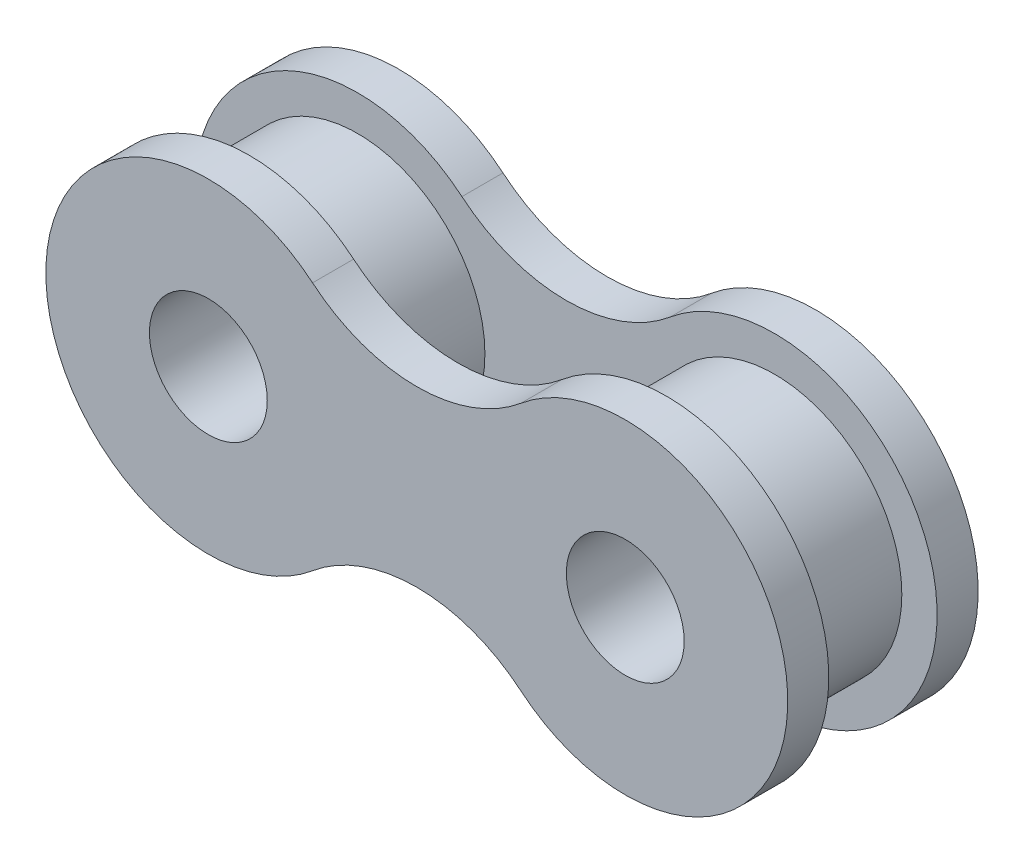
ISO-10303-21;
HEADER;
FILE_DESCRIPTION(('STEP AP214'),'2;1');
FILE_NAME('part.step','',(''),(''),'','','');
FILE_SCHEMA(('AUTOMOTIVE_DESIGN { 1 0 10303 214 1 1 1 1 }'));
ENDSEC;
DATA;
#1=APPLICATION_CONTEXT('core data for automotive mechanical design processes');
#2=APPLICATION_PROTOCOL_DEFINITION('international standard','automotive_design',2000,#1);
#3=PRODUCT_CONTEXT('',#1,'mechanical');
#4=PRODUCT('Part','Part','',(#3));
#5=PRODUCT_RELATED_PRODUCT_CATEGORY('part','',(#4));
#6=PRODUCT_DEFINITION_FORMATION('','',#4);
#7=PRODUCT_DEFINITION_CONTEXT('part definition',#1,'design');
#8=PRODUCT_DEFINITION('design','',#6,#7);
#9=PRODUCT_DEFINITION_SHAPE('','',#8);
#10=(LENGTH_UNIT() NAMED_UNIT(*) SI_UNIT(.MILLI.,.METRE.));
#11=(NAMED_UNIT(*) PLANE_ANGLE_UNIT() SI_UNIT($,.RADIAN.));
#12=(NAMED_UNIT(*) SI_UNIT($,.STERADIAN.) SOLID_ANGLE_UNIT());
#13=UNCERTAINTY_MEASURE_WITH_UNIT(LENGTH_MEASURE(1.E-05),#10,'distance_accuracy_value','');
#14=(GEOMETRIC_REPRESENTATION_CONTEXT(3) GLOBAL_UNCERTAINTY_ASSIGNED_CONTEXT((#13)) GLOBAL_UNIT_ASSIGNED_CONTEXT((#10,
#11,#12)) REPRESENTATION_CONTEXT('',''));
#15=CARTESIAN_POINT('',(0.,0.,0.));
#16=DIRECTION('',(0.,0.,1.));
#17=DIRECTION('',(1.,0.,0.));
#18=AXIS2_PLACEMENT_3D('',#15,#16,#17);
#19=CARTESIAN_POINT('',(9.99200722162641E-13,-12.5440007893938,1.65));
#20=DIRECTION('',(0.,0.,0.999999999999992));
#21=DIRECTION('',(1.00000000000001,0.,0.));
#22=AXIS2_PLACEMENT_3D('',#19,#20,#21);
#23=CYLINDRICAL_SURFACE('',#22,4.95);
#24=CARTESIAN_POINT('',(6.66133814775094E-13,-12.5440007893934,2.8999999999999));
#25=DIRECTION('',(0.,0.,0.999999999999992));
#26=DIRECTION('',(1.00000000000001,0.,0.));
#27=AXIS2_PLACEMENT_3D('',#24,#25,#26);
#28=CIRCLE('',#27,4.95);
#29=CARTESIAN_POINT('',(3.17500000000032,-8.7463864066524,2.90000000000001));
#30=VERTEX_POINT('',#29);
#31=CARTESIAN_POINT('',(-3.17499999999982,-8.74638640665251,2.90000000000004));
#32=VERTEX_POINT('',#31);
#33=EDGE_CURVE('E160',#30,#32,#28,.T.);
#34=ORIENTED_EDGE('',*,*,#33,.T.);
#35=DIRECTION('',(0.,0.,0.999999999999992));
#36=VECTOR('',#35,1.);
#37=CARTESIAN_POINT('',(-3.17499999999971,-8.74638640665221,1.65000000000004));
#38=LINE('',#37,#36);
#39=CARTESIAN_POINT('',(-3.17499999999971,-8.74638640665221,1.65000000000004));
#40=VERTEX_POINT('',#39);
#41=EDGE_CURVE('E12',#40,#32,#38,.T.);
#42=ORIENTED_EDGE('',*,*,#41,.F.);
#43=CARTESIAN_POINT('',(9.99200722162641E-13,-12.5440007893938,1.65));
#44=DIRECTION('',(0.,0.,0.999999999999992));
#45=DIRECTION('',(1.00000000000001,0.,0.));
#46=AXIS2_PLACEMENT_3D('',#43,#44,#45);
#47=CIRCLE('',#46,4.95);
#48=CARTESIAN_POINT('',(3.17500000000059,-8.74638640665265,1.65000000000001));
#49=VERTEX_POINT('',#48);
#50=EDGE_CURVE('E66',#49,#40,#47,.T.);
#51=ORIENTED_EDGE('',*,*,#50,.F.);
#52=DIRECTION('',(0.,0.,0.999999999999992));
#53=VECTOR('',#52,1.);
#54=CARTESIAN_POINT('',(3.17500000000059,-8.74638640665265,1.65000000000001));
#55=LINE('',#54,#53);
#56=EDGE_CURVE('E51',#49,#30,#55,.T.);
#57=ORIENTED_EDGE('',*,*,#56,.T.);
#58=EDGE_LOOP('',(#34,#42,#51,#57));
#59=FACE_BOUND('',#58,.T.);
#60=ADVANCED_FACE('F48',(#59),#23,.F.);
#61=CARTESIAN_POINT('',(-6.34999999999947,-4.94877202391159,1.65000000000001));
#62=DIRECTION('',(0.,0.,0.999999999999992));
#63=DIRECTION('',(1.00000000000001,0.,0.));
#64=AXIS2_PLACEMENT_3D('',#61,#62,#63);
#65=CYLINDRICAL_SURFACE('',#64,4.95);
#66=CARTESIAN_POINT('',(-6.34999999999974,-4.94877202391172,2.90000000000001));
#67=DIRECTION('',(0.,0.,0.999999999999992));
#68=DIRECTION('',(1.00000000000001,0.,0.));
#69=AXIS2_PLACEMENT_3D('',#66,#67,#68);
#70=CIRCLE('',#69,4.95);
#71=CARTESIAN_POINT('',(-3.17499999999965,-1.15115764117063,2.89999999999988));
#72=VERTEX_POINT('',#71);
#73=EDGE_CURVE('E175',#72,#32,#70,.T.);
#74=ORIENTED_EDGE('',*,*,#73,.F.);
#75=DIRECTION('',(0.,0.,0.999999999999992));
#76=VECTOR('',#75,1.);
#77=CARTESIAN_POINT('',(-3.17499999999921,-1.15115764117069,1.6499999999999));
#78=LINE('',#77,#76);
#79=CARTESIAN_POINT('',(-3.17499999999921,-1.15115764117069,1.6499999999999));
#80=VERTEX_POINT('',#79);
#81=EDGE_CURVE('E57',#80,#72,#78,.T.);
#82=ORIENTED_EDGE('',*,*,#81,.F.);
#83=CARTESIAN_POINT('',(-6.34999999999947,-4.94877202391159,1.65000000000001));
#84=DIRECTION('',(0.,0.,0.999999999999992));
#85=DIRECTION('',(1.00000000000001,0.,0.));
#86=AXIS2_PLACEMENT_3D('',#83,#84,#85);
#87=CIRCLE('',#86,4.95);
#88=EDGE_CURVE('E167',#80,#40,#87,.T.);
#89=ORIENTED_EDGE('',*,*,#88,.T.);
#90=ORIENTED_EDGE('',*,*,#41,.T.);
#91=EDGE_LOOP('',(#74,#82,#89,#90));
#92=FACE_BOUND('',#91,.T.);
#93=ADVANCED_FACE('F206',(#92),#65,.T.);
#94=CARTESIAN_POINT('',(4.44089209850063E-13,2.64645674157049,1.65000000000003));
#95=DIRECTION('',(0.,0.,0.999999999999992));
#96=DIRECTION('',(1.00000000000001,0.,0.));
#97=AXIS2_PLACEMENT_3D('',#94,#95,#96);
#98=CYLINDRICAL_SURFACE('',#97,4.95);
#99=CARTESIAN_POINT('',(1.66533453693773E-13,2.64645674156985,2.90000000000003));
#100=DIRECTION('',(0.,0.,0.999999999999992));
#101=DIRECTION('',(1.00000000000001,0.,0.));
#102=AXIS2_PLACEMENT_3D('',#99,#100,#101);
#103=CIRCLE('',#102,4.95);
#104=CARTESIAN_POINT('',(3.17500000000048,-1.15115764117069,2.89999999999996));
#105=VERTEX_POINT('',#104);
#106=EDGE_CURVE('E173',#72,#105,#103,.T.);
#107=ORIENTED_EDGE('',*,*,#106,.T.);
#108=DIRECTION('',(0.,0.,0.999999999999992));
#109=VECTOR('',#108,1.);
#110=CARTESIAN_POINT('',(3.17500000000065,-1.15115764117046,1.64999999999997));
#111=LINE('',#110,#109);
#112=CARTESIAN_POINT('',(3.17500000000065,-1.15115764117046,1.64999999999997));
#113=VERTEX_POINT('',#112);
#114=EDGE_CURVE('E183',#113,#105,#111,.T.);
#115=ORIENTED_EDGE('',*,*,#114,.F.);
#116=CARTESIAN_POINT('',(4.44089209850063E-13,2.64645674157049,1.65000000000003));
#117=DIRECTION('',(0.,0.,0.999999999999992));
#118=DIRECTION('',(1.00000000000001,0.,0.));
#119=AXIS2_PLACEMENT_3D('',#116,#117,#118);
#120=CIRCLE('',#119,4.95);
#121=EDGE_CURVE('E165',#80,#113,#120,.T.);
#122=ORIENTED_EDGE('',*,*,#121,.F.);
#123=ORIENTED_EDGE('',*,*,#81,.T.);
#124=EDGE_LOOP('',(#107,#115,#122,#123));
#125=FACE_BOUND('',#124,.T.);
#126=ADVANCED_FACE('F201',(#125),#98,.F.);
#127=CARTESIAN_POINT('',(6.35000000000063,-4.9487720239115,1.65));
#128=DIRECTION('',(0.,0.,0.999999999999992));
#129=DIRECTION('',(1.00000000000001,0.,0.));
#130=AXIS2_PLACEMENT_3D('',#127,#128,#129);
#131=CYLINDRICAL_SURFACE('',#130,1.795);
#132=CARTESIAN_POINT('',(6.35000000000035,-4.9487720239117,2.9));
#133=DIRECTION('',(0.,0.,0.999999999999992));
#134=DIRECTION('',(1.00000000000001,0.,0.));
#135=AXIS2_PLACEMENT_3D('',#132,#133,#134);
#136=CIRCLE('',#135,1.795);
#137=CARTESIAN_POINT('',(8.14500000000065,-4.9487720239115,2.9));
#138=VERTEX_POINT('',#137);
#139=EDGE_CURVE('E178',#138,#138,#136,.T.);
#140=CARTESIAN_POINT('',(6.35000000000085,-4.94877202391164,-2.9));
#141=DIRECTION('',(0.,0.,0.999999999999992));
#142=DIRECTION('',(1.00000000000001,0.,0.));
#143=AXIS2_PLACEMENT_3D('',#140,#141,#142);
#144=CIRCLE('',#143,1.795);
#145=CARTESIAN_POINT('',(8.14500000000065,-4.9487720239115,-2.9));
#146=VERTEX_POINT('',#145);
#147=EDGE_CURVE('E267',#146,#146,#144,.T.);
#148=CARTESIAN_POINT('',(8.14500000000065,-4.9487720239115,2.9));
#149=CARTESIAN_POINT('',(8.14500000000065,-4.9487720239115,2.83958333333333));
#150=CARTESIAN_POINT('',(8.14500000000065,-4.9487720239115,2.77916666666667));
#151=CARTESIAN_POINT('',(8.14500000000065,-4.9487720239115,2.65833333333333));
#152=CARTESIAN_POINT('',(8.14500000000065,-4.9487720239115,2.59791666666667));
#153=CARTESIAN_POINT('',(8.14500000000065,-4.9487720239115,2.47708333333333));
#154=CARTESIAN_POINT('',(8.14500000000065,-4.9487720239115,2.41666666666667));
#155=CARTESIAN_POINT('',(8.14500000000065,-4.9487720239115,2.29583333333333));
#156=CARTESIAN_POINT('',(8.14500000000065,-4.9487720239115,2.23541666666667));
#157=CARTESIAN_POINT('',(8.14500000000065,-4.9487720239115,2.11458333333333));
#158=CARTESIAN_POINT('',(8.14500000000065,-4.9487720239115,2.05416666666667));
#159=CARTESIAN_POINT('',(8.14500000000065,-4.9487720239115,1.93333333333333));
#160=CARTESIAN_POINT('',(8.14500000000065,-4.9487720239115,1.87291666666667));
#161=CARTESIAN_POINT('',(8.14500000000065,-4.9487720239115,1.75208333333333));
#162=CARTESIAN_POINT('',(8.14500000000065,-4.9487720239115,1.69166666666667));
#163=CARTESIAN_POINT('',(8.14500000000065,-4.9487720239115,1.57083333333333));
#164=CARTESIAN_POINT('',(8.14500000000065,-4.9487720239115,1.51041666666667));
#165=CARTESIAN_POINT('',(8.14500000000065,-4.9487720239115,1.38958333333333));
#166=CARTESIAN_POINT('',(8.14500000000065,-4.9487720239115,1.32916666666667));
#167=CARTESIAN_POINT('',(8.14500000000065,-4.9487720239115,1.20833333333333));
#168=CARTESIAN_POINT('',(8.14500000000065,-4.9487720239115,1.14791666666667));
#169=CARTESIAN_POINT('',(8.14500000000065,-4.9487720239115,1.02708333333333));
#170=CARTESIAN_POINT('',(8.14500000000065,-4.9487720239115,0.966666666666667));
#171=CARTESIAN_POINT('',(8.14500000000065,-4.9487720239115,0.845833333333334));
#172=CARTESIAN_POINT('',(8.14500000000065,-4.9487720239115,0.785416666666667));
#173=CARTESIAN_POINT('',(8.14500000000065,-4.9487720239115,0.664583333333334));
#174=CARTESIAN_POINT('',(8.14500000000065,-4.9487720239115,0.604166666666667));
#175=CARTESIAN_POINT('',(8.14500000000065,-4.9487720239115,0.483333333333334));
#176=CARTESIAN_POINT('',(8.14500000000065,-4.9487720239115,0.422916666666667));
#177=CARTESIAN_POINT('',(8.14500000000065,-4.9487720239115,0.302083333333333));
#178=CARTESIAN_POINT('',(8.14500000000065,-4.9487720239115,0.241666666666667));
#179=CARTESIAN_POINT('',(8.14500000000065,-4.9487720239115,0.120833333333333));
#180=CARTESIAN_POINT('',(8.14500000000065,-4.9487720239115,0.0604166666666668));
#181=CARTESIAN_POINT('',(8.14500000000065,-4.9487720239115,-0.0604166666666664));
#182=CARTESIAN_POINT('',(8.14500000000065,-4.9487720239115,-0.120833333333333));
#183=CARTESIAN_POINT('',(8.14500000000065,-4.9487720239115,-0.241666666666666));
#184=CARTESIAN_POINT('',(8.14500000000065,-4.9487720239115,-0.302083333333333));
#185=CARTESIAN_POINT('',(8.14500000000065,-4.9487720239115,-0.422916666666667));
#186=CARTESIAN_POINT('',(8.14500000000065,-4.9487720239115,-0.483333333333333));
#187=CARTESIAN_POINT('',(8.14500000000065,-4.9487720239115,-0.604166666666667));
#188=CARTESIAN_POINT('',(8.14500000000065,-4.9487720239115,-0.664583333333333));
#189=CARTESIAN_POINT('',(8.14500000000065,-4.9487720239115,-0.785416666666667));
#190=CARTESIAN_POINT('',(8.14500000000065,-4.9487720239115,-0.845833333333333));
#191=CARTESIAN_POINT('',(8.14500000000065,-4.9487720239115,-0.966666666666667));
#192=CARTESIAN_POINT('',(8.14500000000065,-4.9487720239115,-1.02708333333333));
#193=CARTESIAN_POINT('',(8.14500000000065,-4.9487720239115,-1.14791666666667));
#194=CARTESIAN_POINT('',(8.14500000000065,-4.9487720239115,-1.20833333333333));
#195=CARTESIAN_POINT('',(8.14500000000065,-4.9487720239115,-1.32916666666667));
#196=CARTESIAN_POINT('',(8.14500000000065,-4.9487720239115,-1.38958333333333));
#197=CARTESIAN_POINT('',(8.14500000000065,-4.9487720239115,-1.51041666666667));
#198=CARTESIAN_POINT('',(8.14500000000065,-4.9487720239115,-1.57083333333333));
#199=CARTESIAN_POINT('',(8.14500000000065,-4.9487720239115,-1.69166666666667));
#200=CARTESIAN_POINT('',(8.14500000000065,-4.9487720239115,-1.75208333333333));
#201=CARTESIAN_POINT('',(8.14500000000065,-4.9487720239115,-1.87291666666667));
#202=CARTESIAN_POINT('',(8.14500000000065,-4.9487720239115,-1.93333333333333));
#203=CARTESIAN_POINT('',(8.14500000000065,-4.9487720239115,-2.05416666666667));
#204=CARTESIAN_POINT('',(8.14500000000065,-4.9487720239115,-2.11458333333333));
#205=CARTESIAN_POINT('',(8.14500000000065,-4.9487720239115,-2.23541666666667));
#206=CARTESIAN_POINT('',(8.14500000000065,-4.9487720239115,-2.29583333333333));
#207=CARTESIAN_POINT('',(8.14500000000065,-4.9487720239115,-2.41666666666667));
#208=CARTESIAN_POINT('',(8.14500000000065,-4.9487720239115,-2.47708333333333));
#209=CARTESIAN_POINT('',(8.14500000000065,-4.9487720239115,-2.59791666666667));
#210=CARTESIAN_POINT('',(8.14500000000065,-4.9487720239115,-2.65833333333333));
#211=CARTESIAN_POINT('',(8.14500000000065,-4.9487720239115,-2.77916666666667));
#212=CARTESIAN_POINT('',(8.14500000000065,-4.9487720239115,-2.83958333333333));
#213=CARTESIAN_POINT('',(8.14500000000065,-4.9487720239115,-2.9));
#214=B_SPLINE_CURVE_WITH_KNOTS('',3,(#148,#149,#150,#151,#152,#153,#154,#155,#156,#157,#158,
#159,#160,#161,#162,#163,#164,#165,#166,#167,#168,#169,#170,#171,#172,#173,#174,#175,#176,#177,
#178,#179,#180,#181,#182,#183,#184,#185,#186,#187,#188,#189,#190,#191,#192,#193,#194,#195,#196,
#197,#198,#199,#200,#201,#202,#203,#204,#205,#206,#207,#208,#209,#210,#211,#212,#213),
.UNSPECIFIED.,.F.,.F.,(4,2,2,2,2,2,2,2,2,2,2,2,2,2,2,2,2,2,2,2,2,2,2,2,2,2,2,2,2,2,2,2,4),(0.,
0.18125,0.3625,0.54375,0.725,0.90625,1.0875,1.26875,1.45,1.63125,1.8125,1.99375,2.175,2.35625,
2.5375,2.71875,2.9,3.08125,3.2625,3.44375,3.625,3.80625,3.9875,4.16875,4.35,4.53125,4.7125,
4.89375,5.075,5.25625,5.4375,5.61875,5.8),.UNSPECIFIED.);
#215=EDGE_CURVE('BSEAM193',#138,#146,#214,.T.);
#216=ORIENTED_EDGE('',*,*,#139,.T.);
#217=ORIENTED_EDGE('',*,*,#147,.F.);
#218=ORIENTED_EDGE('',*,*,#215,.T.);
#219=ORIENTED_EDGE('',*,*,#215,.F.);
#220=EDGE_LOOP('',(#216,#218,#217,#219));
#221=FACE_BOUND('',#220,.T.);
#222=ADVANCED_FACE('F193',(#221),#131,.F.);
#223=CARTESIAN_POINT('',(6.35000000000063,-4.9487720239115,1.65));
#224=DIRECTION('',(0.,0.,0.999999999999992));
#225=DIRECTION('',(1.00000000000001,0.,0.));
#226=AXIS2_PLACEMENT_3D('',#223,#224,#225);
#227=CYLINDRICAL_SURFACE('',#226,4.95);
#228=CARTESIAN_POINT('',(6.35000000000035,-4.9487720239117,2.9));
#229=DIRECTION('',(0.,0.,0.999999999999992));
#230=DIRECTION('',(1.00000000000001,0.,0.));
#231=AXIS2_PLACEMENT_3D('',#228,#229,#230);
#232=CIRCLE('',#231,4.95);
#233=EDGE_CURVE('E170',#30,#105,#232,.T.);
#234=ORIENTED_EDGE('',*,*,#233,.F.);
#235=ORIENTED_EDGE('',*,*,#56,.F.);
#236=CARTESIAN_POINT('',(6.35000000000063,-4.9487720239115,1.65));
#237=DIRECTION('',(0.,0.,0.999999999999992));
#238=DIRECTION('',(1.00000000000001,0.,0.));
#239=AXIS2_PLACEMENT_3D('',#236,#237,#238);
#240=CIRCLE('',#239,4.95);
#241=EDGE_CURVE('E162',#49,#113,#240,.T.);
#242=ORIENTED_EDGE('',*,*,#241,.T.);
#243=ORIENTED_EDGE('',*,*,#114,.T.);
#244=EDGE_LOOP('',(#234,#235,#242,#243));
#245=FACE_BOUND('',#244,.T.);
#246=ADVANCED_FACE('F190',(#245),#227,.T.);
#247=CARTESIAN_POINT('',(-6.34999999999947,-4.94877202391159,1.65000000000001));
#248=DIRECTION('',(0.,0.,0.999999999999992));
#249=DIRECTION('',(1.00000000000001,0.,0.));
#250=AXIS2_PLACEMENT_3D('',#247,#248,#249);
#251=CYLINDRICAL_SURFACE('',#250,1.795);
#252=CARTESIAN_POINT('',(-6.34999999999974,-4.94877202391172,2.90000000000001));
#253=DIRECTION('',(0.,0.,0.999999999999992));
#254=DIRECTION('',(1.00000000000001,0.,0.));
#255=AXIS2_PLACEMENT_3D('',#252,#253,#254);
#256=CIRCLE('',#255,1.795);
#257=CARTESIAN_POINT('',(-4.55499999999945,-4.94877202391159,2.90000000000001));
#258=VERTEX_POINT('',#257);
#259=EDGE_CURVE('E163',#258,#258,#256,.T.);
#260=CARTESIAN_POINT('',(-6.34999999999997,-4.94877202391178,-2.89999999999999));
#261=DIRECTION('',(0.,0.,0.999999999999992));
#262=DIRECTION('',(1.00000000000001,0.,0.));
#263=AXIS2_PLACEMENT_3D('',#260,#261,#262);
#264=CIRCLE('',#263,1.795);
#265=CARTESIAN_POINT('',(-4.55499999999945,-4.94877202391159,-2.89999999999999));
#266=VERTEX_POINT('',#265);
#267=EDGE_CURVE('E142',#266,#266,#264,.T.);
#268=CARTESIAN_POINT('',(-4.55499999999945,-4.94877202391159,2.90000000000001));
#269=CARTESIAN_POINT('',(-4.55499999999945,-4.94877202391159,2.83958333333335));
#270=CARTESIAN_POINT('',(-4.55499999999945,-4.94877202391159,2.77916666666668));
#271=CARTESIAN_POINT('',(-4.55499999999945,-4.94877202391159,2.65833333333335));
#272=CARTESIAN_POINT('',(-4.55499999999945,-4.94877202391159,2.59791666666668));
#273=CARTESIAN_POINT('',(-4.55499999999945,-4.94877202391159,2.47708333333335));
#274=CARTESIAN_POINT('',(-4.55499999999945,-4.94877202391159,2.41666666666668));
#275=CARTESIAN_POINT('',(-4.55499999999945,-4.94877202391159,2.29583333333335));
#276=CARTESIAN_POINT('',(-4.55499999999945,-4.94877202391159,2.23541666666668));
#277=CARTESIAN_POINT('',(-4.55499999999945,-4.94877202391159,2.11458333333335));
#278=CARTESIAN_POINT('',(-4.55499999999945,-4.94877202391159,2.05416666666668));
#279=CARTESIAN_POINT('',(-4.55499999999945,-4.94877202391159,1.93333333333335));
#280=CARTESIAN_POINT('',(-4.55499999999945,-4.94877202391159,1.87291666666668));
#281=CARTESIAN_POINT('',(-4.55499999999945,-4.94877202391159,1.75208333333335));
#282=CARTESIAN_POINT('',(-4.55499999999945,-4.94877202391159,1.69166666666668));
#283=CARTESIAN_POINT('',(-4.55499999999945,-4.94877202391159,1.57083333333335));
#284=CARTESIAN_POINT('',(-4.55499999999945,-4.94877202391159,1.51041666666668));
#285=CARTESIAN_POINT('',(-4.55499999999945,-4.94877202391159,1.38958333333335));
#286=CARTESIAN_POINT('',(-4.55499999999945,-4.94877202391159,1.32916666666668));
#287=CARTESIAN_POINT('',(-4.55499999999945,-4.94877202391159,1.20833333333335));
#288=CARTESIAN_POINT('',(-4.55499999999945,-4.94877202391159,1.14791666666668));
#289=CARTESIAN_POINT('',(-4.55499999999945,-4.94877202391159,1.02708333333335));
#290=CARTESIAN_POINT('',(-4.55499999999945,-4.94877202391159,0.966666666666681));
#291=CARTESIAN_POINT('',(-4.55499999999945,-4.94877202391159,0.845833333333348));
#292=CARTESIAN_POINT('',(-4.55499999999945,-4.94877202391159,0.785416666666681));
#293=CARTESIAN_POINT('',(-4.55499999999945,-4.94877202391159,0.664583333333348));
#294=CARTESIAN_POINT('',(-4.55499999999945,-4.94877202391159,0.604166666666681));
#295=CARTESIAN_POINT('',(-4.55499999999945,-4.94877202391159,0.483333333333347));
#296=CARTESIAN_POINT('',(-4.55499999999945,-4.94877202391159,0.422916666666681));
#297=CARTESIAN_POINT('',(-4.55499999999945,-4.94877202391159,0.302083333333347));
#298=CARTESIAN_POINT('',(-4.55499999999945,-4.94877202391159,0.241666666666681));
#299=CARTESIAN_POINT('',(-4.55499999999945,-4.94877202391159,0.120833333333347));
#300=CARTESIAN_POINT('',(-4.55499999999945,-4.94877202391159,0.0604166666666807));
#301=CARTESIAN_POINT('',(-4.55499999999945,-4.94877202391159,-0.0604166666666525));
#302=CARTESIAN_POINT('',(-4.55499999999945,-4.94877202391159,-0.120833333333319));
#303=CARTESIAN_POINT('',(-4.55499999999945,-4.94877202391159,-0.241666666666652));
#304=CARTESIAN_POINT('',(-4.55499999999945,-4.94877202391159,-0.302083333333319));
#305=CARTESIAN_POINT('',(-4.55499999999945,-4.94877202391159,-0.422916666666653));
#306=CARTESIAN_POINT('',(-4.55499999999945,-4.94877202391159,-0.483333333333319));
#307=CARTESIAN_POINT('',(-4.55499999999945,-4.94877202391159,-0.604166666666653));
#308=CARTESIAN_POINT('',(-4.55499999999945,-4.94877202391159,-0.664583333333319));
#309=CARTESIAN_POINT('',(-4.55499999999945,-4.94877202391159,-0.785416666666653));
#310=CARTESIAN_POINT('',(-4.55499999999945,-4.94877202391159,-0.845833333333319));
#311=CARTESIAN_POINT('',(-4.55499999999945,-4.94877202391159,-0.966666666666653));
#312=CARTESIAN_POINT('',(-4.55499999999945,-4.94877202391159,-1.02708333333332));
#313=CARTESIAN_POINT('',(-4.55499999999945,-4.94877202391159,-1.14791666666665));
#314=CARTESIAN_POINT('',(-4.55499999999945,-4.94877202391159,-1.20833333333332));
#315=CARTESIAN_POINT('',(-4.55499999999945,-4.94877202391159,-1.32916666666665));
#316=CARTESIAN_POINT('',(-4.55499999999945,-4.94877202391159,-1.38958333333332));
#317=CARTESIAN_POINT('',(-4.55499999999945,-4.94877202391159,-1.51041666666665));
#318=CARTESIAN_POINT('',(-4.55499999999945,-4.94877202391159,-1.57083333333332));
#319=CARTESIAN_POINT('',(-4.55499999999945,-4.94877202391159,-1.69166666666665));
#320=CARTESIAN_POINT('',(-4.55499999999945,-4.94877202391159,-1.75208333333332));
#321=CARTESIAN_POINT('',(-4.55499999999945,-4.94877202391159,-1.87291666666665));
#322=CARTESIAN_POINT('',(-4.55499999999945,-4.94877202391159,-1.93333333333332));
#323=CARTESIAN_POINT('',(-4.55499999999945,-4.94877202391159,-2.05416666666665));
#324=CARTESIAN_POINT('',(-4.55499999999945,-4.94877202391159,-2.11458333333332));
#325=CARTESIAN_POINT('',(-4.55499999999945,-4.94877202391159,-2.23541666666665));
#326=CARTESIAN_POINT('',(-4.55499999999945,-4.94877202391159,-2.29583333333332));
#327=CARTESIAN_POINT('',(-4.55499999999945,-4.94877202391159,-2.41666666666665));
#328=CARTESIAN_POINT('',(-4.55499999999945,-4.94877202391159,-2.47708333333332));
#329=CARTESIAN_POINT('',(-4.55499999999945,-4.94877202391159,-2.59791666666665));
#330=CARTESIAN_POINT('',(-4.55499999999945,-4.94877202391159,-2.65833333333332));
#331=CARTESIAN_POINT('',(-4.55499999999945,-4.94877202391159,-2.77916666666665));
#332=CARTESIAN_POINT('',(-4.55499999999945,-4.94877202391159,-2.83958333333332));
#333=CARTESIAN_POINT('',(-4.55499999999945,-4.94877202391159,-2.89999999999999));
#334=B_SPLINE_CURVE_WITH_KNOTS('',3,(#268,#269,#270,#271,#272,#273,#274,#275,#276,#277,#278,
#279,#280,#281,#282,#283,#284,#285,#286,#287,#288,#289,#290,#291,#292,#293,#294,#295,#296,#297,
#298,#299,#300,#301,#302,#303,#304,#305,#306,#307,#308,#309,#310,#311,#312,#313,#314,#315,#316,
#317,#318,#319,#320,#321,#322,#323,#324,#325,#326,#327,#328,#329,#330,#331,#332,#333),
.UNSPECIFIED.,.F.,.F.,(4,2,2,2,2,2,2,2,2,2,2,2,2,2,2,2,2,2,2,2,2,2,2,2,2,2,2,2,2,2,2,2,4),(0.,
0.18125,0.3625,0.54375,0.725,0.90625,1.0875,1.26875,1.45,1.63125,1.8125,1.99375,2.175,2.35625,
2.5375,2.71875,2.9,3.08125,3.2625,3.44375,3.625,3.80625,3.9875,4.16875,4.35,4.53125,4.7125,
4.89375,5.075,5.25625,5.4375,5.61875,5.8),.UNSPECIFIED.);
#335=EDGE_CURVE('BSEAM192',#258,#266,#334,.T.);
#336=ORIENTED_EDGE('',*,*,#259,.T.);
#337=ORIENTED_EDGE('',*,*,#267,.F.);
#338=ORIENTED_EDGE('',*,*,#335,.T.);
#339=ORIENTED_EDGE('',*,*,#335,.F.);
#340=EDGE_LOOP('',(#336,#338,#337,#339));
#341=FACE_BOUND('',#340,.T.);
#342=ADVANCED_FACE('F192',(#341),#251,.F.);
#343=CARTESIAN_POINT('',(3.88578058618805E-13,1.94289029309402E-13,1.65));
#344=DIRECTION('',(0.,0.,0.999999999999992));
#345=DIRECTION('',(1.00000000000001,0.,0.));
#346=AXIS2_PLACEMENT_3D('',#343,#344,#345);
#347=PLANE('',#346);
#348=CARTESIAN_POINT('',(6.35000000000063,-4.9487720239115,1.64999999998372));
#349=DIRECTION('',(0.,0.,0.999999999999992));
#350=DIRECTION('',(1.00000000000001,0.,0.));
#351=AXIS2_PLACEMENT_3D('',#348,#349,#350);
#352=CIRCLE('',#351,3.875);
#353=CARTESIAN_POINT('',(10.2250000000005,-4.94877202391136,1.64999999998372));
#354=VERTEX_POINT('',#353);
#355=EDGE_CURVE('E254',#354,#354,#352,.T.);
#356=ORIENTED_EDGE('',*,*,#355,.T.);
#357=EDGE_LOOP('',(#356));
#358=FACE_BOUND('',#357,.T.);
#359=CARTESIAN_POINT('',(-6.34999999999947,-4.94877202391159,1.64999999998373));
#360=DIRECTION('',(0.,0.,0.999999999999992));
#361=DIRECTION('',(1.00000000000001,0.,0.));
#362=AXIS2_PLACEMENT_3D('',#359,#360,#361);
#363=CIRCLE('',#362,3.875);
#364=CARTESIAN_POINT('',(-2.47499999999971,-4.94877202391159,1.64999999998372));
#365=VERTEX_POINT('',#364);
#366=EDGE_CURVE('E156',#365,#365,#363,.T.);
#367=ORIENTED_EDGE('',*,*,#366,.T.);
#368=EDGE_LOOP('',(#367));
#369=FACE_BOUND('',#368,.T.);
#370=ORIENTED_EDGE('',*,*,#50,.T.);
#371=ORIENTED_EDGE('',*,*,#88,.F.);
#372=ORIENTED_EDGE('',*,*,#121,.T.);
#373=ORIENTED_EDGE('',*,*,#241,.F.);
#374=EDGE_LOOP('',(#370,#371,#372,#373));
#375=FACE_BOUND('',#374,.T.);
#376=ADVANCED_FACE('F198',(#358,#369,#375),#347,.F.);
#377=CARTESIAN_POINT('',(4.44089209850063E-13,4.71844785465692E-13,2.9));
#378=DIRECTION('',(0.,0.,0.999999999999992));
#379=DIRECTION('',(1.00000000000001,0.,0.));
#380=AXIS2_PLACEMENT_3D('',#377,#378,#379);
#381=PLANE('',#380);
#382=ORIENTED_EDGE('',*,*,#33,.F.);
#383=ORIENTED_EDGE('',*,*,#233,.T.);
#384=ORIENTED_EDGE('',*,*,#106,.F.);
#385=ORIENTED_EDGE('',*,*,#73,.T.);
#386=EDGE_LOOP('',(#382,#383,#384,#385));
#387=FACE_BOUND('',#386,.T.);
#388=ORIENTED_EDGE('',*,*,#139,.F.);
#389=EDGE_LOOP('',(#388));
#390=FACE_BOUND('',#389,.T.);
#391=ORIENTED_EDGE('',*,*,#259,.F.);
#392=EDGE_LOOP('',(#391));
#393=FACE_BOUND('',#392,.T.);
#394=ADVANCED_FACE('F188',(#387,#390,#393),#381,.T.);
#395=CARTESIAN_POINT('',(-6.34999999999974,-4.94877202391159,-499999.999999996));
#396=DIRECTION('',(0.,0.,0.999999999999992));
#397=DIRECTION('',(1.00000000000001,0.,0.));
#398=AXIS2_PLACEMENT_3D('',#395,#396,#397);
#399=CYLINDRICAL_SURFACE('',#398,3.875);
#400=CARTESIAN_POINT('',(-6.34999999999997,-4.94877202391175,-1.64999999998371));
#401=DIRECTION('',(0.,0.,-0.999999999999992));
#402=DIRECTION('',(-1.00000000000001,0.,0.));
#403=AXIS2_PLACEMENT_3D('',#400,#401,#402);
#404=CIRCLE('',#403,3.875);
#405=CARTESIAN_POINT('',(-2.47499999999971,-4.94877202391159,-1.64999999998372));
#406=VERTEX_POINT('',#405);
#407=EDGE_CURVE('E153',#406,#406,#404,.F.);
#408=CARTESIAN_POINT('',(-2.47499999999971,-4.94877202391159,-1.64999999998372));
#409=CARTESIAN_POINT('',(-2.47499999999971,-4.94877202391159,-1.61562499998051));
#410=CARTESIAN_POINT('',(-2.47499999999971,-4.94877202391159,-1.58124999997729));
#411=CARTESIAN_POINT('',(-2.47499999999971,-4.94877202391159,-1.51249999997087));
#412=CARTESIAN_POINT('',(-2.47499999999971,-4.94877202391159,-1.47812499996765));
#413=CARTESIAN_POINT('',(-2.47499999999971,-4.94877202391159,-1.40937499998017));
#414=CARTESIAN_POINT('',(-2.47499999999971,-4.94877202391159,-1.37499999999591));
#415=CARTESIAN_POINT('',(-2.47499999999971,-4.94877202391159,-1.30625000000843));
#416=CARTESIAN_POINT('',(-2.47499999999971,-4.94877202391159,-1.27187500000521));
#417=CARTESIAN_POINT('',(-2.47499999999971,-4.94877202391159,-1.20312499999879));
#418=CARTESIAN_POINT('',(-2.47499999999971,-4.94877202391159,-1.16874999999557));
#419=CARTESIAN_POINT('',(-2.47499999999971,-4.94877202391159,-1.09999999998915));
#420=CARTESIAN_POINT('',(-2.47499999999971,-4.94877202391159,-1.06562499998593));
#421=CARTESIAN_POINT('',(-2.47499999999971,-4.94877202391159,-0.996874999979506));
#422=CARTESIAN_POINT('',(-2.47499999999971,-4.94877202391159,-0.962499999976293));
#423=CARTESIAN_POINT('',(-2.47499999999971,-4.94877202391159,-0.893749999988813));
#424=CARTESIAN_POINT('',(-2.47499999999971,-4.94877202391159,-0.859375000004547));
#425=CARTESIAN_POINT('',(-2.47499999999971,-4.94877202391159,-0.790625000017068));
#426=CARTESIAN_POINT('',(-2.47499999999971,-4.94877202391159,-0.756250000013855));
#427=CARTESIAN_POINT('',(-2.47499999999971,-4.94877202391159,-0.687500000007428));
#428=CARTESIAN_POINT('',(-2.47499999999971,-4.94877202391159,-0.653125000004214));
#429=CARTESIAN_POINT('',(-2.47499999999971,-4.94877202391159,-0.584374999997787));
#430=CARTESIAN_POINT('',(-2.47499999999971,-4.94877202391159,-0.549999999994573));
#431=CARTESIAN_POINT('',(-2.47499999999971,-4.94877202391159,-0.481249999988146));
#432=CARTESIAN_POINT('',(-2.47499999999971,-4.94877202391159,-0.446874999984933));
#433=CARTESIAN_POINT('',(-2.47499999999971,-4.94877202391159,-0.378124999978506));
#434=CARTESIAN_POINT('',(-2.47499999999971,-4.94877202391159,-0.343749999975292));
#435=CARTESIAN_POINT('',(-2.47499999999971,-4.94877202391159,-0.274999999987813));
#436=CARTESIAN_POINT('',(-2.47499999999971,-4.94877202391159,-0.240625000003547));
#437=CARTESIAN_POINT('',(-2.47499999999971,-4.94877202391159,-0.171875000016068));
#438=CARTESIAN_POINT('',(-2.47499999999971,-4.94877202391159,-0.137500000012854));
#439=CARTESIAN_POINT('',(-2.47499999999971,-4.94877202391159,-0.0687500000064271));
#440=CARTESIAN_POINT('',(-2.47499999999971,-4.94877202391159,-0.0343750000032136));
#441=CARTESIAN_POINT('',(-2.47499999999971,-4.94877202391159,0.0343750000032136));
#442=CARTESIAN_POINT('',(-2.47499999999971,-4.94877202391159,0.0687500000064271));
#443=CARTESIAN_POINT('',(-2.47499999999971,-4.94877202391159,0.137500000012854));
#444=CARTESIAN_POINT('',(-2.47499999999971,-4.94877202391159,0.171875000016068));
#445=CARTESIAN_POINT('',(-2.47499999999971,-4.94877202391159,0.240625000003547));
#446=CARTESIAN_POINT('',(-2.47499999999971,-4.94877202391159,0.274999999987813));
#447=CARTESIAN_POINT('',(-2.47499999999971,-4.94877202391159,0.343749999975292));
#448=CARTESIAN_POINT('',(-2.47499999999971,-4.94877202391159,0.378124999978506));
#449=CARTESIAN_POINT('',(-2.47499999999971,-4.94877202391159,0.446874999984933));
#450=CARTESIAN_POINT('',(-2.47499999999971,-4.94877202391159,0.481249999988146));
#451=CARTESIAN_POINT('',(-2.47499999999971,-4.94877202391159,0.549999999994573));
#452=CARTESIAN_POINT('',(-2.47499999999971,-4.94877202391159,0.584374999997787));
#453=CARTESIAN_POINT('',(-2.47499999999971,-4.94877202391159,0.653125000004214));
#454=CARTESIAN_POINT('',(-2.47499999999971,-4.94877202391159,0.687500000007428));
#455=CARTESIAN_POINT('',(-2.47499999999971,-4.94877202391159,0.756250000013855));
#456=CARTESIAN_POINT('',(-2.47499999999971,-4.94877202391159,0.790625000017068));
#457=CARTESIAN_POINT('',(-2.47499999999971,-4.94877202391159,0.859375000004547));
#458=CARTESIAN_POINT('',(-2.47499999999971,-4.94877202391159,0.893749999988813));
#459=CARTESIAN_POINT('',(-2.47499999999971,-4.94877202391159,0.962499999976293));
#460=CARTESIAN_POINT('',(-2.47499999999971,-4.94877202391159,0.996874999979506));
#461=CARTESIAN_POINT('',(-2.47499999999971,-4.94877202391159,1.06562499998593));
#462=CARTESIAN_POINT('',(-2.47499999999971,-4.94877202391159,1.09999999998915));
#463=CARTESIAN_POINT('',(-2.47499999999971,-4.94877202391159,1.16874999999557));
#464=CARTESIAN_POINT('',(-2.47499999999971,-4.94877202391159,1.20312499999879));
#465=CARTESIAN_POINT('',(-2.47499999999971,-4.94877202391159,1.27187500000521));
#466=CARTESIAN_POINT('',(-2.47499999999971,-4.94877202391159,1.30625000000843));
#467=CARTESIAN_POINT('',(-2.47499999999971,-4.94877202391159,1.37499999999591));
#468=CARTESIAN_POINT('',(-2.47499999999971,-4.94877202391159,1.40937499998017));
#469=CARTESIAN_POINT('',(-2.47499999999971,-4.94877202391159,1.47812499996765));
#470=CARTESIAN_POINT('',(-2.47499999999971,-4.94877202391159,1.51249999997087));
#471=CARTESIAN_POINT('',(-2.47499999999971,-4.94877202391159,1.58124999997729));
#472=CARTESIAN_POINT('',(-2.47499999999971,-4.94877202391159,1.61562499998051));
#473=CARTESIAN_POINT('',(-2.47499999999971,-4.94877202391159,1.64999999998372));
#474=B_SPLINE_CURVE_WITH_KNOTS('',3,(#408,#409,#410,#411,#412,#413,#414,#415,#416,#417,#418,
#419,#420,#421,#422,#423,#424,#425,#426,#427,#428,#429,#430,#431,#432,#433,#434,#435,#436,#437,
#438,#439,#440,#441,#442,#443,#444,#445,#446,#447,#448,#449,#450,#451,#452,#453,#454,#455,#456,
#457,#458,#459,#460,#461,#462,#463,#464,#465,#466,#467,#468,#469,#470,#471,#472,#473),
.UNSPECIFIED.,.F.,.F.,(4,2,2,2,2,2,2,2,2,2,2,2,2,2,2,2,2,2,2,2,2,2,2,2,2,2,2,2,2,2,2,2,4),(0.,
0.103125000009641,0.206250000019281,0.309374999972079,0.412499999981719,0.51562499999136,
0.618750000001,0.721875000010641,0.824999999963438,0.928124999973079,1.03124999998272,
1.13437499999236,1.237500000002,1.34062500001164,1.44374999996444,1.54687499997408,
1.64999999998372,1.75312499999336,1.856250000003,1.9593749999558,2.06249999996544,
2.16562499997508,2.26874999998472,2.37187499999436,2.475000000004,2.5781249999568,
2.68124999996644,2.78437499997608,2.88749999998572,2.99062499999536,3.09374999994816,
3.1968749999578,3.29999999996744),.UNSPECIFIED.);
#475=EDGE_CURVE('BSEAM217',#406,#365,#474,.T.);
#476=ORIENTED_EDGE('',*,*,#407,.T.);
#477=ORIENTED_EDGE('',*,*,#366,.F.);
#478=ORIENTED_EDGE('',*,*,#475,.T.);
#479=ORIENTED_EDGE('',*,*,#475,.F.);
#480=EDGE_LOOP('',(#476,#478,#477,#479));
#481=FACE_BOUND('',#480,.T.);
#482=ADVANCED_FACE('F217',(#481),#399,.T.);
#483=CARTESIAN_POINT('',(2.22044604925031E-13,-12.5440007893935,-1.65000000000001));
#484=DIRECTION('',(0.,0.,-0.999999999999992));
#485=DIRECTION('',(1.00000000000001,0.,0.));
#486=AXIS2_PLACEMENT_3D('',#483,#484,#485);
#487=CYLINDRICAL_SURFACE('',#486,4.95);
#488=CARTESIAN_POINT('',(3.33066907387547E-13,-12.544000789393,-2.9));
#489=DIRECTION('',(0.,0.,0.999999999999992));
#490=DIRECTION('',(1.00000000000001,0.,0.));
#491=AXIS2_PLACEMENT_3D('',#488,#489,#490);
#492=CIRCLE('',#491,4.95);
#493=CARTESIAN_POINT('',(3.17500000000048,-8.7463864066526,-2.89999999999999));
#494=VERTEX_POINT('',#493);
#495=CARTESIAN_POINT('',(-3.17499999999971,-8.74638640665221,-2.89999999999994));
#496=VERTEX_POINT('',#495);
#497=EDGE_CURVE('E146',#494,#496,#492,.T.);
#498=ORIENTED_EDGE('',*,*,#497,.F.);
#499=DIRECTION('',(0.,0.,-0.999999999999992));
#500=VECTOR('',#499,1.);
#501=CARTESIAN_POINT('',(3.17500000000032,-8.74638640665226,-1.64999999999998));
#502=LINE('',#501,#500);
#503=CARTESIAN_POINT('',(3.17500000000032,-8.74638640665226,-1.64999999999998));
#504=VERTEX_POINT('',#503);
#505=EDGE_CURVE('E126',#504,#494,#502,.T.);
#506=ORIENTED_EDGE('',*,*,#505,.F.);
#507=CARTESIAN_POINT('',(2.22044604925031E-13,-12.5440007893935,-1.65000000000001));
#508=DIRECTION('',(0.,0.,0.999999999999992));
#509=DIRECTION('',(1.00000000000001,0.,0.));
#510=AXIS2_PLACEMENT_3D('',#507,#508,#509);
#511=CIRCLE('',#510,4.95);
#512=CARTESIAN_POINT('',(-3.17499999999987,-8.74638640665271,-1.64999999999996));
#513=VERTEX_POINT('',#512);
#514=EDGE_CURVE('E133',#504,#513,#511,.T.);
#515=ORIENTED_EDGE('',*,*,#514,.T.);
#516=DIRECTION('',(0.,0.,-0.999999999999992));
#517=VECTOR('',#516,1.);
#518=CARTESIAN_POINT('',(-3.17499999999987,-8.74638640665271,-1.64999999999996));
#519=LINE('',#518,#517);
#520=EDGE_CURVE('E157',#513,#496,#519,.T.);
#521=ORIENTED_EDGE('',*,*,#520,.T.);
#522=EDGE_LOOP('',(#498,#506,#515,#521));
#523=FACE_BOUND('',#522,.T.);
#524=ADVANCED_FACE('F144',(#523),#487,.F.);
#525=CARTESIAN_POINT('',(-6.34999999999997,-4.94877202391175,-1.64999999999998));
#526=DIRECTION('',(0.,0.,-0.999999999999992));
#527=DIRECTION('',(1.00000000000001,0.,0.));
#528=AXIS2_PLACEMENT_3D('',#525,#526,#527);
#529=CYLINDRICAL_SURFACE('',#528,4.95);
#530=CARTESIAN_POINT('',(-6.34999999999997,-4.94877202391178,-2.89999999999999));
#531=DIRECTION('',(0.,0.,0.999999999999992));
#532=DIRECTION('',(1.00000000000001,0.,0.));
#533=AXIS2_PLACEMENT_3D('',#530,#531,#532);
#534=CIRCLE('',#533,4.95);
#535=CARTESIAN_POINT('',(-3.17499999999954,-1.15115764117077,-2.89999999999983));
#536=VERTEX_POINT('',#535);
#537=EDGE_CURVE('E265',#536,#496,#534,.T.);
#538=ORIENTED_EDGE('',*,*,#537,.T.);
#539=ORIENTED_EDGE('',*,*,#520,.F.);
#540=CARTESIAN_POINT('',(-6.34999999999997,-4.94877202391175,-1.64999999999998));
#541=DIRECTION('',(0.,0.,0.999999999999992));
#542=DIRECTION('',(1.00000000000001,0.,0.));
#543=AXIS2_PLACEMENT_3D('',#540,#541,#542);
#544=CIRCLE('',#543,4.95);
#545=CARTESIAN_POINT('',(-3.17499999999982,-1.15115764117085,-1.64999999999996));
#546=VERTEX_POINT('',#545);
#547=EDGE_CURVE('E138',#546,#513,#544,.T.);
#548=ORIENTED_EDGE('',*,*,#547,.F.);
#549=DIRECTION('',(0.,0.,-0.999999999999992));
#550=VECTOR('',#549,1.);
#551=CARTESIAN_POINT('',(-3.17499999999982,-1.15115764117085,-1.64999999999996));
#552=LINE('',#551,#550);
#553=EDGE_CURVE('E148',#546,#536,#552,.T.);
#554=ORIENTED_EDGE('',*,*,#553,.T.);
#555=EDGE_LOOP('',(#538,#539,#548,#554));
#556=FACE_BOUND('',#555,.T.);
#557=ADVANCED_FACE('F226',(#556),#529,.T.);
#558=CARTESIAN_POINT('',(2.22044604925031E-13,2.64645674156985,-1.64999999999996));
#559=DIRECTION('',(0.,0.,-0.999999999999992));
#560=DIRECTION('',(1.00000000000001,0.,0.));
#561=AXIS2_PLACEMENT_3D('',#558,#559,#560);
#562=CYLINDRICAL_SURFACE('',#561,4.95);
#563=CARTESIAN_POINT('',(3.88578058618805E-13,2.6464567415706,-2.89999999999996));
#564=DIRECTION('',(0.,0.,0.999999999999992));
#565=DIRECTION('',(1.00000000000001,0.,0.));
#566=AXIS2_PLACEMENT_3D('',#563,#564,#565);
#567=CIRCLE('',#566,4.95);
#568=CARTESIAN_POINT('',(3.17500000000059,-1.15115764117063,-2.90000000000003));
#569=VERTEX_POINT('',#568);
#570=EDGE_CURVE('E262',#536,#569,#567,.T.);
#571=ORIENTED_EDGE('',*,*,#570,.F.);
#572=ORIENTED_EDGE('',*,*,#553,.F.);
#573=CARTESIAN_POINT('',(2.22044604925031E-13,2.64645674156985,-1.64999999999996));
#574=DIRECTION('',(0.,0.,0.999999999999992));
#575=DIRECTION('',(1.00000000000001,0.,0.));
#576=AXIS2_PLACEMENT_3D('',#573,#574,#575);
#577=CIRCLE('',#576,4.95);
#578=CARTESIAN_POINT('',(3.17500000000065,-1.15115764117082,-1.65000000000003));
#579=VERTEX_POINT('',#578);
#580=EDGE_CURVE('E132',#546,#579,#577,.T.);
#581=ORIENTED_EDGE('',*,*,#580,.T.);
#582=DIRECTION('',(0.,0.,-0.999999999999992));
#583=VECTOR('',#582,1.);
#584=CARTESIAN_POINT('',(3.17500000000065,-1.15115764117082,-1.65000000000003));
#585=LINE('',#584,#583);
#586=EDGE_CURVE('E129',#579,#569,#585,.T.);
#587=ORIENTED_EDGE('',*,*,#586,.T.);
#588=EDGE_LOOP('',(#571,#572,#581,#587));
#589=FACE_BOUND('',#588,.T.);
#590=ADVANCED_FACE('F229',(#589),#562,.F.);
#591=CARTESIAN_POINT('',(6.35000000000063,-4.94877202391161,-1.65));
#592=DIRECTION('',(0.,0.,-0.999999999999992));
#593=DIRECTION('',(1.00000000000001,0.,0.));
#594=AXIS2_PLACEMENT_3D('',#591,#592,#593);
#595=CYLINDRICAL_SURFACE('',#594,4.95);
#596=CARTESIAN_POINT('',(6.35000000000085,-4.94877202391164,-2.9));
#597=DIRECTION('',(0.,0.,0.999999999999992));
#598=DIRECTION('',(1.00000000000001,0.,0.));
#599=AXIS2_PLACEMENT_3D('',#596,#597,#598);
#600=CIRCLE('',#599,4.95);
#601=EDGE_CURVE('E256',#494,#569,#600,.T.);
#602=ORIENTED_EDGE('',*,*,#601,.T.);
#603=ORIENTED_EDGE('',*,*,#586,.F.);
#604=CARTESIAN_POINT('',(6.35000000000063,-4.94877202391161,-1.65));
#605=DIRECTION('',(0.,0.,0.999999999999992));
#606=DIRECTION('',(1.00000000000001,0.,0.));
#607=AXIS2_PLACEMENT_3D('',#604,#605,#606);
#608=CIRCLE('',#607,4.95);
#609=EDGE_CURVE('E122',#504,#579,#608,.T.);
#610=ORIENTED_EDGE('',*,*,#609,.F.);
#611=ORIENTED_EDGE('',*,*,#505,.T.);
#612=EDGE_LOOP('',(#602,#603,#610,#611));
#613=FACE_BOUND('',#612,.T.);
#614=ADVANCED_FACE('F124',(#613),#595,.T.);
#615=CARTESIAN_POINT('',(1.66533453693773E-13,1.66533453693773E-13,-1.65));
#616=DIRECTION('',(0.,0.,-0.999999999999992));
#617=DIRECTION('',(1.00000000000001,0.,0.));
#618=AXIS2_PLACEMENT_3D('',#615,#616,#617);
#619=PLANE('',#618);
#620=CARTESIAN_POINT('',(6.35000000000063,-4.94877202391161,-1.64999999998372));
#621=DIRECTION('',(0.,0.,-0.999999999999992));
#622=DIRECTION('',(-1.00000000000001,0.,0.));
#623=AXIS2_PLACEMENT_3D('',#620,#621,#622);
#624=CIRCLE('',#623,3.875);
#625=CARTESIAN_POINT('',(10.2250000000005,-4.94877202391136,-1.64999999998372));
#626=VERTEX_POINT('',#625);
#627=EDGE_CURVE('E251',#626,#626,#624,.F.);
#628=ORIENTED_EDGE('',*,*,#627,.F.);
#629=EDGE_LOOP('',(#628));
#630=FACE_BOUND('',#629,.T.);
#631=ORIENTED_EDGE('',*,*,#407,.F.);
#632=EDGE_LOOP('',(#631));
#633=FACE_BOUND('',#632,.T.);
#634=ORIENTED_EDGE('',*,*,#514,.F.);
#635=ORIENTED_EDGE('',*,*,#609,.T.);
#636=ORIENTED_EDGE('',*,*,#580,.F.);
#637=ORIENTED_EDGE('',*,*,#547,.T.);
#638=EDGE_LOOP('',(#634,#635,#636,#637));
#639=FACE_BOUND('',#638,.T.);
#640=ADVANCED_FACE('F136',(#630,#633,#639),#619,.F.);
#641=CARTESIAN_POINT('',(4.44089209850063E-13,-1.38777878078145E-13,-2.9));
#642=DIRECTION('',(0.,0.,-0.999999999999992));
#643=DIRECTION('',(1.00000000000001,0.,0.));
#644=AXIS2_PLACEMENT_3D('',#641,#642,#643);
#645=PLANE('',#644);
#646=ORIENTED_EDGE('',*,*,#497,.T.);
#647=ORIENTED_EDGE('',*,*,#537,.F.);
#648=ORIENTED_EDGE('',*,*,#570,.T.);
#649=ORIENTED_EDGE('',*,*,#601,.F.);
#650=EDGE_LOOP('',(#646,#647,#648,#649));
#651=FACE_BOUND('',#650,.T.);
#652=ORIENTED_EDGE('',*,*,#147,.T.);
#653=EDGE_LOOP('',(#652));
#654=FACE_BOUND('',#653,.T.);
#655=ORIENTED_EDGE('',*,*,#267,.T.);
#656=EDGE_LOOP('',(#655));
#657=FACE_BOUND('',#656,.T.);
#658=ADVANCED_FACE('F236',(#651,#654,#657),#645,.T.);
#659=CARTESIAN_POINT('',(6.35000000000047,-4.94877202391136,-499999.999999996));
#660=DIRECTION('',(0.,0.,0.999999999999992));
#661=DIRECTION('',(1.00000000000001,0.,0.));
#662=AXIS2_PLACEMENT_3D('',#659,#660,#661);
#663=CYLINDRICAL_SURFACE('',#662,3.875);
#664=CARTESIAN_POINT('',(10.2250000000005,-4.94877202391136,-1.64999999998372));
#665=CARTESIAN_POINT('',(10.2250000000005,-4.94877202391136,-1.61562499998051));
#666=CARTESIAN_POINT('',(10.2250000000005,-4.94877202391136,-1.58124999997729));
#667=CARTESIAN_POINT('',(10.2250000000005,-4.94877202391136,-1.51249999997087));
#668=CARTESIAN_POINT('',(10.2250000000005,-4.94877202391136,-1.47812499996765));
#669=CARTESIAN_POINT('',(10.2250000000005,-4.94877202391136,-1.40937499998017));
#670=CARTESIAN_POINT('',(10.2250000000005,-4.94877202391136,-1.37499999999591));
#671=CARTESIAN_POINT('',(10.2250000000005,-4.94877202391136,-1.30625000000843));
#672=CARTESIAN_POINT('',(10.2250000000005,-4.94877202391136,-1.27187500000521));
#673=CARTESIAN_POINT('',(10.2250000000005,-4.94877202391136,-1.20312499999879));
#674=CARTESIAN_POINT('',(10.2250000000005,-4.94877202391136,-1.16874999999557));
#675=CARTESIAN_POINT('',(10.2250000000005,-4.94877202391136,-1.09999999998915));
#676=CARTESIAN_POINT('',(10.2250000000005,-4.94877202391136,-1.06562499998593));
#677=CARTESIAN_POINT('',(10.2250000000005,-4.94877202391136,-0.996874999979506));
#678=CARTESIAN_POINT('',(10.2250000000005,-4.94877202391136,-0.962499999976293));
#679=CARTESIAN_POINT('',(10.2250000000005,-4.94877202391136,-0.893749999988813));
#680=CARTESIAN_POINT('',(10.2250000000005,-4.94877202391136,-0.859375000004547));
#681=CARTESIAN_POINT('',(10.2250000000005,-4.94877202391136,-0.790625000017068));
#682=CARTESIAN_POINT('',(10.2250000000005,-4.94877202391136,-0.756250000013855));
#683=CARTESIAN_POINT('',(10.2250000000005,-4.94877202391136,-0.687500000007428));
#684=CARTESIAN_POINT('',(10.2250000000005,-4.94877202391136,-0.653125000004214));
#685=CARTESIAN_POINT('',(10.2250000000005,-4.94877202391136,-0.584374999997787));
#686=CARTESIAN_POINT('',(10.2250000000005,-4.94877202391136,-0.549999999994573));
#687=CARTESIAN_POINT('',(10.2250000000005,-4.94877202391136,-0.481249999988146));
#688=CARTESIAN_POINT('',(10.2250000000005,-4.94877202391136,-0.446874999984933));
#689=CARTESIAN_POINT('',(10.2250000000005,-4.94877202391136,-0.378124999978506));
#690=CARTESIAN_POINT('',(10.2250000000005,-4.94877202391136,-0.343749999975292));
#691=CARTESIAN_POINT('',(10.2250000000005,-4.94877202391136,-0.274999999987813));
#692=CARTESIAN_POINT('',(10.2250000000005,-4.94877202391136,-0.240625000003547));
#693=CARTESIAN_POINT('',(10.2250000000005,-4.94877202391136,-0.171875000016068));
#694=CARTESIAN_POINT('',(10.2250000000005,-4.94877202391136,-0.137500000012854));
#695=CARTESIAN_POINT('',(10.2250000000005,-4.94877202391136,-0.0687500000064271));
#696=CARTESIAN_POINT('',(10.2250000000005,-4.94877202391136,-0.0343750000032136));
#697=CARTESIAN_POINT('',(10.2250000000005,-4.94877202391136,0.0343750000032136));
#698=CARTESIAN_POINT('',(10.2250000000005,-4.94877202391136,0.0687500000064271));
#699=CARTESIAN_POINT('',(10.2250000000005,-4.94877202391136,0.137500000012854));
#700=CARTESIAN_POINT('',(10.2250000000005,-4.94877202391136,0.171875000016068));
#701=CARTESIAN_POINT('',(10.2250000000005,-4.94877202391136,0.240625000003547));
#702=CARTESIAN_POINT('',(10.2250000000005,-4.94877202391136,0.274999999987813));
#703=CARTESIAN_POINT('',(10.2250000000005,-4.94877202391136,0.343749999975292));
#704=CARTESIAN_POINT('',(10.2250000000005,-4.94877202391136,0.378124999978506));
#705=CARTESIAN_POINT('',(10.2250000000005,-4.94877202391136,0.446874999984933));
#706=CARTESIAN_POINT('',(10.2250000000005,-4.94877202391136,0.481249999988146));
#707=CARTESIAN_POINT('',(10.2250000000005,-4.94877202391136,0.549999999994573));
#708=CARTESIAN_POINT('',(10.2250000000005,-4.94877202391136,0.584374999997787));
#709=CARTESIAN_POINT('',(10.2250000000005,-4.94877202391136,0.653125000004214));
#710=CARTESIAN_POINT('',(10.2250000000005,-4.94877202391136,0.687500000007428));
#711=CARTESIAN_POINT('',(10.2250000000005,-4.94877202391136,0.756250000013855));
#712=CARTESIAN_POINT('',(10.2250000000005,-4.94877202391136,0.790625000017068));
#713=CARTESIAN_POINT('',(10.2250000000005,-4.94877202391136,0.859375000004547));
#714=CARTESIAN_POINT('',(10.2250000000005,-4.94877202391136,0.893749999988813));
#715=CARTESIAN_POINT('',(10.2250000000005,-4.94877202391136,0.962499999976293));
#716=CARTESIAN_POINT('',(10.2250000000005,-4.94877202391136,0.996874999979506));
#717=CARTESIAN_POINT('',(10.2250000000005,-4.94877202391136,1.06562499998593));
#718=CARTESIAN_POINT('',(10.2250000000005,-4.94877202391136,1.09999999998915));
#719=CARTESIAN_POINT('',(10.2250000000005,-4.94877202391136,1.16874999999557));
#720=CARTESIAN_POINT('',(10.2250000000005,-4.94877202391136,1.20312499999879));
#721=CARTESIAN_POINT('',(10.2250000000005,-4.94877202391136,1.27187500000521));
#722=CARTESIAN_POINT('',(10.2250000000005,-4.94877202391136,1.30625000000843));
#723=CARTESIAN_POINT('',(10.2250000000005,-4.94877202391136,1.37499999999591));
#724=CARTESIAN_POINT('',(10.2250000000005,-4.94877202391136,1.40937499998017));
#725=CARTESIAN_POINT('',(10.2250000000005,-4.94877202391136,1.47812499996765));
#726=CARTESIAN_POINT('',(10.2250000000005,-4.94877202391136,1.51249999997087));
#727=CARTESIAN_POINT('',(10.2250000000005,-4.94877202391136,1.58124999997729));
#728=CARTESIAN_POINT('',(10.2250000000005,-4.94877202391136,1.61562499998051));
#729=CARTESIAN_POINT('',(10.2250000000005,-4.94877202391136,1.64999999998372));
#730=B_SPLINE_CURVE_WITH_KNOTS('',3,(#664,#665,#666,#667,#668,#669,#670,#671,#672,#673,#674,
#675,#676,#677,#678,#679,#680,#681,#682,#683,#684,#685,#686,#687,#688,#689,#690,#691,#692,#693,
#694,#695,#696,#697,#698,#699,#700,#701,#702,#703,#704,#705,#706,#707,#708,#709,#710,#711,#712,
#713,#714,#715,#716,#717,#718,#719,#720,#721,#722,#723,#724,#725,#726,#727,#728,#729),
.UNSPECIFIED.,.F.,.F.,(4,2,2,2,2,2,2,2,2,2,2,2,2,2,2,2,2,2,2,2,2,2,2,2,2,2,2,2,2,2,2,2,4),(0.,
0.103125000009641,0.206250000019281,0.309374999972079,0.412499999981719,0.51562499999136,
0.618750000001,0.721875000010641,0.824999999963438,0.928124999973079,1.03124999998272,
1.13437499999236,1.237500000002,1.34062500001164,1.44374999996444,1.54687499997408,
1.64999999998372,1.75312499999336,1.856250000003,1.9593749999558,2.06249999996544,
2.16562499997508,2.26874999998472,2.37187499999436,2.475000000004,2.5781249999568,
2.68124999996644,2.78437499997608,2.88749999998572,2.99062499999536,3.09374999994816,
3.1968749999578,3.29999999996744),.UNSPECIFIED.);
#731=EDGE_CURVE('BSEAM239',#626,#354,#730,.T.);
#732=ORIENTED_EDGE('',*,*,#627,.T.);
#733=ORIENTED_EDGE('',*,*,#355,.F.);
#734=ORIENTED_EDGE('',*,*,#731,.T.);
#735=ORIENTED_EDGE('',*,*,#731,.F.);
#736=EDGE_LOOP('',(#732,#734,#733,#735));
#737=FACE_BOUND('',#736,.T.);
#738=ADVANCED_FACE('F239',(#737),#663,.T.);
#739=CLOSED_SHELL('',(#60,#93,#126,#222,#246,#342,#376,#394,#482,#524,#557,#590,#614,#640,#658,#738));
#740=MANIFOLD_SOLID_BREP('B2',#739);
#741=ADVANCED_BREP_SHAPE_REPRESENTATION('',(#18,#740),#14);
#742=SHAPE_DEFINITION_REPRESENTATION(#9,#741);
ENDSEC;
END-ISO-10303-21;
